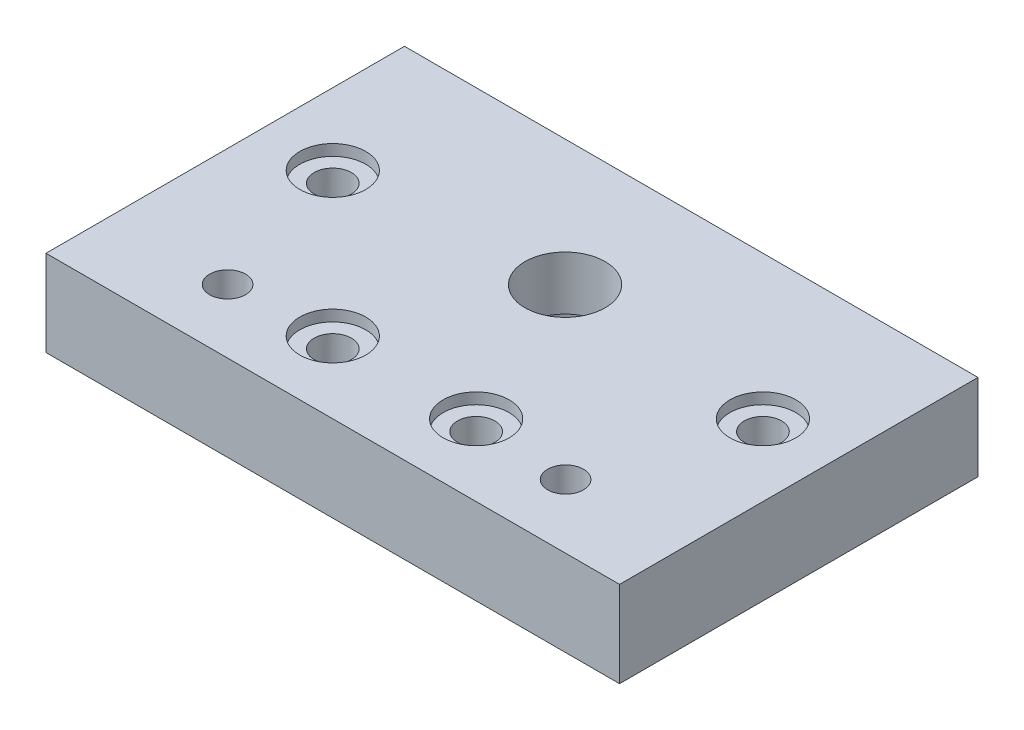
ISO-10303-21;
HEADER;
FILE_DESCRIPTION(('STEP AP214'),'2;1');
FILE_NAME('part.step','',(''),(''),'','','');
FILE_SCHEMA(('AUTOMOTIVE_DESIGN { 1 0 10303 214 1 1 1 1 }'));
ENDSEC;
DATA;
#1=APPLICATION_CONTEXT('core data for automotive mechanical design processes');
#2=APPLICATION_PROTOCOL_DEFINITION('international standard','automotive_design',2000,#1);
#3=PRODUCT_CONTEXT('',#1,'mechanical');
#4=PRODUCT('Part','Part','',(#3));
#5=PRODUCT_RELATED_PRODUCT_CATEGORY('part','',(#4));
#6=PRODUCT_DEFINITION_FORMATION('','',#4);
#7=PRODUCT_DEFINITION_CONTEXT('part definition',#1,'design');
#8=PRODUCT_DEFINITION('design','',#6,#7);
#9=PRODUCT_DEFINITION_SHAPE('','',#8);
#10=(LENGTH_UNIT() NAMED_UNIT(*) SI_UNIT(.MILLI.,.METRE.));
#11=(NAMED_UNIT(*) PLANE_ANGLE_UNIT() SI_UNIT($,.RADIAN.));
#12=(NAMED_UNIT(*) SI_UNIT($,.STERADIAN.) SOLID_ANGLE_UNIT());
#13=UNCERTAINTY_MEASURE_WITH_UNIT(LENGTH_MEASURE(1.E-05),#10,'distance_accuracy_value','');
#14=(GEOMETRIC_REPRESENTATION_CONTEXT(3) GLOBAL_UNCERTAINTY_ASSIGNED_CONTEXT((#13)) GLOBAL_UNIT_ASSIGNED_CONTEXT((#10,
#11,#12)) REPRESENTATION_CONTEXT('',''));
#15=CARTESIAN_POINT('',(0.,0.,0.));
#16=DIRECTION('',(0.,0.,1.));
#17=DIRECTION('',(1.,0.,0.));
#18=AXIS2_PLACEMENT_3D('',#15,#16,#17);
#19=CARTESIAN_POINT('',(0.,12.,0.));
#20=DIRECTION('',(0.,1.,0.));
#21=DIRECTION('',(0.,0.,1.));
#22=AXIS2_PLACEMENT_3D('',#19,#20,#21);
#23=PLANE('',#22);
#24=DIRECTION('',(-1.,0.,0.));
#25=VECTOR('',#24,1.);
#26=CARTESIAN_POINT('',(-40.,12.,-25.));
#27=LINE('',#26,#25);
#28=CARTESIAN_POINT('',(40.,12.,-25.));
#29=VERTEX_POINT('',#28);
#30=CARTESIAN_POINT('',(-40.,12.,-25.));
#31=VERTEX_POINT('',#30);
#32=EDGE_CURVE('E10',#29,#31,#27,.T.);
#33=ORIENTED_EDGE('',*,*,#32,.T.);
#34=DIRECTION('',(0.,0.,1.));
#35=VECTOR('',#34,1.);
#36=CARTESIAN_POINT('',(-40.,12.,25.));
#37=LINE('',#36,#35);
#38=CARTESIAN_POINT('',(-40.,12.,25.));
#39=VERTEX_POINT('',#38);
#40=EDGE_CURVE('E19',#31,#39,#37,.T.);
#41=ORIENTED_EDGE('',*,*,#40,.T.);
#42=DIRECTION('',(1.,0.,0.));
#43=VECTOR('',#42,1.);
#44=CARTESIAN_POINT('',(40.,12.,25.));
#45=LINE('',#44,#43);
#46=CARTESIAN_POINT('',(40.,12.,25.));
#47=VERTEX_POINT('',#46);
#48=EDGE_CURVE('E223',#39,#47,#45,.T.);
#49=ORIENTED_EDGE('',*,*,#48,.T.);
#50=DIRECTION('',(0.,0.,-1.));
#51=VECTOR('',#50,1.);
#52=CARTESIAN_POINT('',(40.,12.,-25.));
#53=LINE('',#52,#51);
#54=EDGE_CURVE('E162',#47,#29,#53,.T.);
#55=ORIENTED_EDGE('',*,*,#54,.T.);
#56=EDGE_LOOP('',(#33,#41,#49,#55));
#57=FACE_BOUND('',#56,.T.);
#58=CARTESIAN_POINT('',(-23.57,12.,16.1));
#59=DIRECTION('',(0.,-1.,0.));
#60=DIRECTION('',(1.,0.,0.));
#61=AXIS2_PLACEMENT_3D('',#58,#59,#60);
#62=CIRCLE('',#61,2.5);
#63=CARTESIAN_POINT('',(-26.07,12.,16.1));
#64=VERTEX_POINT('',#63);
#65=EDGE_CURVE('E139',#64,#64,#62,.T.);
#66=ORIENTED_EDGE('',*,*,#65,.T.);
#67=EDGE_LOOP('',(#66));
#68=FACE_BOUND('',#67,.T.);
#69=CARTESIAN_POINT('',(23.57,12.,16.1));
#70=DIRECTION('',(0.,-1.,0.));
#71=DIRECTION('',(1.,0.,0.));
#72=AXIS2_PLACEMENT_3D('',#69,#70,#71);
#73=CIRCLE('',#72,2.5);
#74=CARTESIAN_POINT('',(21.07,12.,16.1));
#75=VERTEX_POINT('',#74);
#76=EDGE_CURVE('E195',#75,#75,#73,.T.);
#77=ORIENTED_EDGE('',*,*,#76,.T.);
#78=EDGE_LOOP('',(#77));
#79=FACE_BOUND('',#78,.T.);
#80=CARTESIAN_POINT('',(0.,12.,-7.4));
#81=DIRECTION('',(0.,-1.,0.));
#82=DIRECTION('',(1.,0.,0.));
#83=AXIS2_PLACEMENT_3D('',#80,#81,#82);
#84=CIRCLE('',#83,5.59);
#85=CARTESIAN_POINT('',(-5.59,12.,-7.4));
#86=VERTEX_POINT('',#85);
#87=EDGE_CURVE('E206',#86,#86,#84,.T.);
#88=ORIENTED_EDGE('',*,*,#87,.T.);
#89=EDGE_LOOP('',(#88));
#90=FACE_BOUND('',#89,.T.);
#91=CARTESIAN_POINT('',(10.,12.,15.));
#92=DIRECTION('',(0.,-1.,0.));
#93=DIRECTION('',(-1.,0.,0.));
#94=AXIS2_PLACEMENT_3D('',#91,#92,#93);
#95=CIRCLE('',#94,4.6);
#96=CARTESIAN_POINT('',(14.6,12.,15.));
#97=VERTEX_POINT('',#96);
#98=EDGE_CURVE('E182',#97,#97,#95,.T.);
#99=ORIENTED_EDGE('',*,*,#98,.T.);
#100=EDGE_LOOP('',(#99));
#101=FACE_BOUND('',#100,.T.);
#102=CARTESIAN_POINT('',(-30.,12.,-5.));
#103=DIRECTION('',(0.,-1.,0.));
#104=DIRECTION('',(-1.,0.,0.));
#105=AXIS2_PLACEMENT_3D('',#102,#103,#104);
#106=CIRCLE('',#105,4.6);
#107=CARTESIAN_POINT('',(-25.4,12.,-5.));
#108=VERTEX_POINT('',#107);
#109=EDGE_CURVE('E224',#108,#108,#106,.T.);
#110=ORIENTED_EDGE('',*,*,#109,.T.);
#111=EDGE_LOOP('',(#110));
#112=FACE_BOUND('',#111,.T.);
#113=CARTESIAN_POINT('',(-10.,12.,15.));
#114=DIRECTION('',(0.,-1.,0.));
#115=DIRECTION('',(-1.,0.,0.));
#116=AXIS2_PLACEMENT_3D('',#113,#114,#115);
#117=CIRCLE('',#116,4.6);
#118=CARTESIAN_POINT('',(-5.4,12.,15.));
#119=VERTEX_POINT('',#118);
#120=EDGE_CURVE('E177',#119,#119,#117,.T.);
#121=ORIENTED_EDGE('',*,*,#120,.T.);
#122=EDGE_LOOP('',(#121));
#123=FACE_BOUND('',#122,.T.);
#124=CARTESIAN_POINT('',(30.,12.,-5.));
#125=DIRECTION('',(0.,-1.,0.));
#126=DIRECTION('',(-1.,0.,0.));
#127=AXIS2_PLACEMENT_3D('',#124,#125,#126);
#128=CIRCLE('',#127,4.6);
#129=CARTESIAN_POINT('',(34.6,12.,-5.));
#130=VERTEX_POINT('',#129);
#131=EDGE_CURVE('E199',#130,#130,#128,.T.);
#132=ORIENTED_EDGE('',*,*,#131,.T.);
#133=EDGE_LOOP('',(#132));
#134=FACE_BOUND('',#133,.T.);
#135=ADVANCED_FACE('F15',(#57,#68,#79,#90,#101,#112,#123,#134),#23,.T.);
#136=CARTESIAN_POINT('',(0.,0.,0.));
#137=DIRECTION('',(0.,1.,0.));
#138=DIRECTION('',(0.,0.,1.));
#139=AXIS2_PLACEMENT_3D('',#136,#137,#138);
#140=PLANE('',#139);
#141=DIRECTION('',(1.,0.,0.));
#142=VECTOR('',#141,1.);
#143=CARTESIAN_POINT('',(-40.,0.,-25.));
#144=LINE('',#143,#142);
#145=CARTESIAN_POINT('',(-40.,0.,-25.));
#146=VERTEX_POINT('',#145);
#147=CARTESIAN_POINT('',(40.,0.,-25.));
#148=VERTEX_POINT('',#147);
#149=EDGE_CURVE('E26',#146,#148,#144,.T.);
#150=ORIENTED_EDGE('',*,*,#149,.T.);
#151=DIRECTION('',(0.,0.,1.));
#152=VECTOR('',#151,1.);
#153=CARTESIAN_POINT('',(40.,0.,-25.));
#154=LINE('',#153,#152);
#155=CARTESIAN_POINT('',(40.,0.,25.));
#156=VERTEX_POINT('',#155);
#157=EDGE_CURVE('E147',#148,#156,#154,.T.);
#158=ORIENTED_EDGE('',*,*,#157,.T.);
#159=DIRECTION('',(-1.,0.,0.));
#160=VECTOR('',#159,1.);
#161=CARTESIAN_POINT('',(40.,0.,25.));
#162=LINE('',#161,#160);
#163=CARTESIAN_POINT('',(-40.,0.,25.));
#164=VERTEX_POINT('',#163);
#165=EDGE_CURVE('E229',#156,#164,#162,.T.);
#166=ORIENTED_EDGE('',*,*,#165,.T.);
#167=DIRECTION('',(0.,0.,-1.));
#168=VECTOR('',#167,1.);
#169=CARTESIAN_POINT('',(-40.,0.,25.));
#170=LINE('',#169,#168);
#171=EDGE_CURVE('E222',#164,#146,#170,.T.);
#172=ORIENTED_EDGE('',*,*,#171,.T.);
#173=EDGE_LOOP('',(#150,#158,#166,#172));
#174=FACE_BOUND('',#173,.T.);
#175=CARTESIAN_POINT('',(-23.57,0.,16.1));
#176=DIRECTION('',(0.,1.,0.));
#177=DIRECTION('',(1.,0.,0.));
#178=AXIS2_PLACEMENT_3D('',#175,#176,#177);
#179=CIRCLE('',#178,2.5);
#180=CARTESIAN_POINT('',(-26.07,0.,16.1));
#181=VERTEX_POINT('',#180);
#182=EDGE_CURVE('E143',#181,#181,#179,.T.);
#183=ORIENTED_EDGE('',*,*,#182,.T.);
#184=EDGE_LOOP('',(#183));
#185=FACE_BOUND('',#184,.T.);
#186=CARTESIAN_POINT('',(23.57,0.,16.1));
#187=DIRECTION('',(0.,1.,0.));
#188=DIRECTION('',(1.,0.,0.));
#189=AXIS2_PLACEMENT_3D('',#186,#187,#188);
#190=CIRCLE('',#189,2.5);
#191=CARTESIAN_POINT('',(21.07,0.,16.1));
#192=VERTEX_POINT('',#191);
#193=EDGE_CURVE('E153',#192,#192,#190,.T.);
#194=ORIENTED_EDGE('',*,*,#193,.T.);
#195=EDGE_LOOP('',(#194));
#196=FACE_BOUND('',#195,.T.);
#197=CARTESIAN_POINT('',(-30.,0.,-5.));
#198=DIRECTION('',(0.,1.,0.));
#199=DIRECTION('',(1.,0.,0.));
#200=AXIS2_PLACEMENT_3D('',#197,#198,#199);
#201=CIRCLE('',#200,2.6);
#202=CARTESIAN_POINT('',(-32.6,0.,-5.));
#203=VERTEX_POINT('',#202);
#204=EDGE_CURVE('E202',#203,#203,#201,.T.);
#205=ORIENTED_EDGE('',*,*,#204,.T.);
#206=EDGE_LOOP('',(#205));
#207=FACE_BOUND('',#206,.T.);
#208=CARTESIAN_POINT('',(30.,0.,-5.));
#209=DIRECTION('',(0.,1.,0.));
#210=DIRECTION('',(1.,0.,0.));
#211=AXIS2_PLACEMENT_3D('',#208,#209,#210);
#212=CIRCLE('',#211,2.6);
#213=CARTESIAN_POINT('',(27.4,0.,-5.));
#214=VERTEX_POINT('',#213);
#215=EDGE_CURVE('E192',#214,#214,#212,.T.);
#216=ORIENTED_EDGE('',*,*,#215,.T.);
#217=EDGE_LOOP('',(#216));
#218=FACE_BOUND('',#217,.T.);
#219=CARTESIAN_POINT('',(-10.,0.,15.));
#220=DIRECTION('',(0.,1.,0.));
#221=DIRECTION('',(1.,0.,0.));
#222=AXIS2_PLACEMENT_3D('',#219,#220,#221);
#223=CIRCLE('',#222,2.6);
#224=CARTESIAN_POINT('',(-12.6,0.,15.));
#225=VERTEX_POINT('',#224);
#226=EDGE_CURVE('E189',#225,#225,#223,.T.);
#227=ORIENTED_EDGE('',*,*,#226,.T.);
#228=EDGE_LOOP('',(#227));
#229=FACE_BOUND('',#228,.T.);
#230=CARTESIAN_POINT('',(10.,0.,15.));
#231=DIRECTION('',(0.,1.,0.));
#232=DIRECTION('',(1.,0.,0.));
#233=AXIS2_PLACEMENT_3D('',#230,#231,#232);
#234=CIRCLE('',#233,2.6);
#235=CARTESIAN_POINT('',(7.4,0.,15.));
#236=VERTEX_POINT('',#235);
#237=EDGE_CURVE('E193',#236,#236,#234,.T.);
#238=ORIENTED_EDGE('',*,*,#237,.T.);
#239=EDGE_LOOP('',(#238));
#240=FACE_BOUND('',#239,.T.);
#241=CARTESIAN_POINT('',(0.,0.,-7.4));
#242=DIRECTION('',(0.,1.,0.));
#243=DIRECTION('',(-1.,0.,0.));
#244=AXIS2_PLACEMENT_3D('',#241,#242,#243);
#245=CIRCLE('',#244,8.05);
#246=CARTESIAN_POINT('',(8.05,0.,-7.4));
#247=VERTEX_POINT('',#246);
#248=EDGE_CURVE('E113',#247,#247,#245,.T.);
#249=ORIENTED_EDGE('',*,*,#248,.T.);
#250=EDGE_LOOP('',(#249));
#251=FACE_BOUND('',#250,.T.);
#252=ADVANCED_FACE('F144',(#174,#185,#196,#207,#218,#229,#240,#251),#140,.F.);
#253=CARTESIAN_POINT('',(40.,0.,-25.));
#254=DIRECTION('',(0.,0.,-1.));
#255=DIRECTION('',(-1.,0.,0.));
#256=AXIS2_PLACEMENT_3D('',#253,#254,#255);
#257=PLANE('',#256);
#258=ORIENTED_EDGE('',*,*,#149,.F.);
#259=DIRECTION('',(0.,1.,0.));
#260=VECTOR('',#259,1.);
#261=CARTESIAN_POINT('',(-40.,0.,-25.));
#262=LINE('',#261,#260);
#263=EDGE_CURVE('E167',#146,#31,#262,.T.);
#264=ORIENTED_EDGE('',*,*,#263,.T.);
#265=ORIENTED_EDGE('',*,*,#32,.F.);
#266=DIRECTION('',(0.,1.,0.));
#267=VECTOR('',#266,1.);
#268=CARTESIAN_POINT('',(40.,0.,-25.));
#269=LINE('',#268,#267);
#270=EDGE_CURVE('E151',#148,#29,#269,.T.);
#271=ORIENTED_EDGE('',*,*,#270,.F.);
#272=EDGE_LOOP('',(#258,#264,#265,#271));
#273=FACE_BOUND('',#272,.T.);
#274=CARTESIAN_POINT('',(-10.,6.,-25.));
#275=DIRECTION('',(0.,0.,1.));
#276=DIRECTION('',(-1.,0.,0.));
#277=AXIS2_PLACEMENT_3D('',#274,#275,#276);
#278=CIRCLE('',#277,2.067);
#279=CARTESIAN_POINT('',(-12.067,6.,-25.));
#280=VERTEX_POINT('',#279);
#281=EDGE_CURVE('E166',#280,#280,#278,.T.);
#282=ORIENTED_EDGE('',*,*,#281,.T.);
#283=EDGE_LOOP('',(#282));
#284=FACE_BOUND('',#283,.T.);
#285=CARTESIAN_POINT('',(10.,6.,-25.));
#286=DIRECTION('',(0.,0.,1.));
#287=DIRECTION('',(-1.,0.,0.));
#288=AXIS2_PLACEMENT_3D('',#285,#286,#287);
#289=CIRCLE('',#288,2.067);
#290=CARTESIAN_POINT('',(7.933,6.,-25.));
#291=VERTEX_POINT('',#290);
#292=EDGE_CURVE('E157',#291,#291,#289,.T.);
#293=ORIENTED_EDGE('',*,*,#292,.T.);
#294=EDGE_LOOP('',(#293));
#295=FACE_BOUND('',#294,.T.);
#296=ADVANCED_FACE('F258',(#273,#284,#295),#257,.T.);
#297=CARTESIAN_POINT('',(-40.,0.,-25.));
#298=DIRECTION('',(-1.,0.,0.));
#299=DIRECTION('',(0.,0.,1.));
#300=AXIS2_PLACEMENT_3D('',#297,#298,#299);
#301=PLANE('',#300);
#302=ORIENTED_EDGE('',*,*,#171,.F.);
#303=DIRECTION('',(0.,1.,0.));
#304=VECTOR('',#303,1.);
#305=CARTESIAN_POINT('',(-40.,0.,25.));
#306=LINE('',#305,#304);
#307=EDGE_CURVE('E218',#164,#39,#306,.T.);
#308=ORIENTED_EDGE('',*,*,#307,.T.);
#309=ORIENTED_EDGE('',*,*,#40,.F.);
#310=ORIENTED_EDGE('',*,*,#263,.F.);
#311=EDGE_LOOP('',(#302,#308,#309,#310));
#312=FACE_BOUND('',#311,.T.);
#313=ADVANCED_FACE('F248',(#312),#301,.T.);
#314=CARTESIAN_POINT('',(-40.,0.,25.));
#315=DIRECTION('',(0.,0.,1.));
#316=DIRECTION('',(1.,0.,0.));
#317=AXIS2_PLACEMENT_3D('',#314,#315,#316);
#318=PLANE('',#317);
#319=ORIENTED_EDGE('',*,*,#165,.F.);
#320=DIRECTION('',(0.,1.,0.));
#321=VECTOR('',#320,1.);
#322=CARTESIAN_POINT('',(40.,0.,25.));
#323=LINE('',#322,#321);
#324=EDGE_CURVE('E188',#156,#47,#323,.T.);
#325=ORIENTED_EDGE('',*,*,#324,.T.);
#326=ORIENTED_EDGE('',*,*,#48,.F.);
#327=ORIENTED_EDGE('',*,*,#307,.F.);
#328=EDGE_LOOP('',(#319,#325,#326,#327));
#329=FACE_BOUND('',#328,.T.);
#330=ADVANCED_FACE('F250',(#329),#318,.T.);
#331=CARTESIAN_POINT('',(40.,0.,25.));
#332=DIRECTION('',(1.,0.,0.));
#333=DIRECTION('',(0.,0.,-1.));
#334=AXIS2_PLACEMENT_3D('',#331,#332,#333);
#335=PLANE('',#334);
#336=ORIENTED_EDGE('',*,*,#157,.F.);
#337=ORIENTED_EDGE('',*,*,#270,.T.);
#338=ORIENTED_EDGE('',*,*,#54,.F.);
#339=ORIENTED_EDGE('',*,*,#324,.F.);
#340=EDGE_LOOP('',(#336,#337,#338,#339));
#341=FACE_BOUND('',#340,.T.);
#342=ADVANCED_FACE('F255',(#341),#335,.T.);
#343=CARTESIAN_POINT('',(-23.57,0.,16.1));
#344=DIRECTION('',(0.,-1.,0.));
#345=DIRECTION('',(1.,0.,0.));
#346=AXIS2_PLACEMENT_3D('',#343,#344,#345);
#347=CYLINDRICAL_SURFACE('',#346,2.5);
#348=ORIENTED_EDGE('',*,*,#182,.F.);
#349=EDGE_LOOP('',(#348));
#350=FACE_BOUND('',#349,.T.);
#351=ORIENTED_EDGE('',*,*,#65,.F.);
#352=EDGE_LOOP('',(#351));
#353=FACE_BOUND('',#352,.T.);
#354=ADVANCED_FACE('F345',(#350,#353),#347,.F.);
#355=CARTESIAN_POINT('',(23.57,0.,16.1));
#356=DIRECTION('',(0.,-1.,0.));
#357=DIRECTION('',(1.,0.,0.));
#358=AXIS2_PLACEMENT_3D('',#355,#356,#357);
#359=CYLINDRICAL_SURFACE('',#358,2.5);
#360=ORIENTED_EDGE('',*,*,#193,.F.);
#361=EDGE_LOOP('',(#360));
#362=FACE_BOUND('',#361,.T.);
#363=ORIENTED_EDGE('',*,*,#76,.F.);
#364=EDGE_LOOP('',(#363));
#365=FACE_BOUND('',#364,.T.);
#366=ADVANCED_FACE('F308',(#362,#365),#359,.F.);
#367=CARTESIAN_POINT('',(-30.,0.,-5.));
#368=DIRECTION('',(0.,-1.,0.));
#369=DIRECTION('',(1.,0.,0.));
#370=AXIS2_PLACEMENT_3D('',#367,#368,#369);
#371=CYLINDRICAL_SURFACE('',#370,2.6);
#372=ORIENTED_EDGE('',*,*,#204,.F.);
#373=EDGE_LOOP('',(#372));
#374=FACE_BOUND('',#373,.T.);
#375=CARTESIAN_POINT('',(-30.,10.45,-5.));
#376=DIRECTION('',(0.,1.,0.));
#377=DIRECTION('',(1.,0.,0.));
#378=AXIS2_PLACEMENT_3D('',#375,#376,#377);
#379=CIRCLE('',#378,2.6);
#380=CARTESIAN_POINT('',(-27.4,10.45,-5.));
#381=VERTEX_POINT('',#380);
#382=EDGE_CURVE('E226',#381,#381,#379,.T.);
#383=ORIENTED_EDGE('',*,*,#382,.T.);
#384=EDGE_LOOP('',(#383));
#385=FACE_BOUND('',#384,.T.);
#386=ADVANCED_FACE('F266',(#374,#385),#371,.F.);
#387=CARTESIAN_POINT('',(30.,0.,-5.));
#388=DIRECTION('',(0.,-1.,0.));
#389=DIRECTION('',(1.,0.,0.));
#390=AXIS2_PLACEMENT_3D('',#387,#388,#389);
#391=CYLINDRICAL_SURFACE('',#390,2.6);
#392=ORIENTED_EDGE('',*,*,#215,.F.);
#393=EDGE_LOOP('',(#392));
#394=FACE_BOUND('',#393,.T.);
#395=CARTESIAN_POINT('',(30.,10.45,-5.));
#396=DIRECTION('',(0.,1.,0.));
#397=DIRECTION('',(1.,0.,0.));
#398=AXIS2_PLACEMENT_3D('',#395,#396,#397);
#399=CIRCLE('',#398,2.6);
#400=CARTESIAN_POINT('',(27.4,10.45,-5.));
#401=VERTEX_POINT('',#400);
#402=EDGE_CURVE('E205',#401,#401,#399,.T.);
#403=ORIENTED_EDGE('',*,*,#402,.T.);
#404=EDGE_LOOP('',(#403));
#405=FACE_BOUND('',#404,.T.);
#406=ADVANCED_FACE('F17',(#394,#405),#391,.F.);
#407=CARTESIAN_POINT('',(-10.,0.,15.));
#408=DIRECTION('',(0.,-1.,0.));
#409=DIRECTION('',(1.,0.,0.));
#410=AXIS2_PLACEMENT_3D('',#407,#408,#409);
#411=CYLINDRICAL_SURFACE('',#410,2.6);
#412=ORIENTED_EDGE('',*,*,#226,.F.);
#413=EDGE_LOOP('',(#412));
#414=FACE_BOUND('',#413,.T.);
#415=CARTESIAN_POINT('',(-10.,10.45,15.));
#416=DIRECTION('',(0.,1.,0.));
#417=DIRECTION('',(1.,0.,0.));
#418=AXIS2_PLACEMENT_3D('',#415,#416,#417);
#419=CIRCLE('',#418,2.6);
#420=CARTESIAN_POINT('',(-7.4,10.45,15.));
#421=VERTEX_POINT('',#420);
#422=EDGE_CURVE('E174',#421,#421,#419,.T.);
#423=ORIENTED_EDGE('',*,*,#422,.T.);
#424=EDGE_LOOP('',(#423));
#425=FACE_BOUND('',#424,.T.);
#426=ADVANCED_FACE('F320',(#414,#425),#411,.F.);
#427=CARTESIAN_POINT('',(10.,0.,15.));
#428=DIRECTION('',(0.,-1.,0.));
#429=DIRECTION('',(1.,0.,0.));
#430=AXIS2_PLACEMENT_3D('',#427,#428,#429);
#431=CYLINDRICAL_SURFACE('',#430,2.6);
#432=ORIENTED_EDGE('',*,*,#237,.F.);
#433=EDGE_LOOP('',(#432));
#434=FACE_BOUND('',#433,.T.);
#435=CARTESIAN_POINT('',(10.,10.45,15.));
#436=DIRECTION('',(0.,1.,0.));
#437=DIRECTION('',(1.,0.,0.));
#438=AXIS2_PLACEMENT_3D('',#435,#436,#437);
#439=CIRCLE('',#438,2.6);
#440=CARTESIAN_POINT('',(12.6,10.45,15.));
#441=VERTEX_POINT('',#440);
#442=EDGE_CURVE('E184',#441,#441,#439,.T.);
#443=ORIENTED_EDGE('',*,*,#442,.T.);
#444=EDGE_LOOP('',(#443));
#445=FACE_BOUND('',#444,.T.);
#446=ADVANCED_FACE('F317',(#434,#445),#431,.F.);
#447=CARTESIAN_POINT('',(0.,0.,-7.4));
#448=DIRECTION('',(0.,-1.,0.));
#449=DIRECTION('',(1.,0.,0.));
#450=AXIS2_PLACEMENT_3D('',#447,#448,#449);
#451=CYLINDRICAL_SURFACE('',#450,5.59);
#452=ORIENTED_EDGE('',*,*,#87,.F.);
#453=EDGE_LOOP('',(#452));
#454=FACE_BOUND('',#453,.T.);
#455=CARTESIAN_POINT('',(0.,4.5,-7.4));
#456=DIRECTION('',(0.,-1.,0.));
#457=DIRECTION('',(1.,0.,0.));
#458=AXIS2_PLACEMENT_3D('',#455,#456,#457);
#459=CIRCLE('',#458,5.59);
#460=CARTESIAN_POINT('',(-5.59,4.5,-7.4));
#461=VERTEX_POINT('',#460);
#462=EDGE_CURVE('E200',#461,#461,#459,.T.);
#463=ORIENTED_EDGE('',*,*,#462,.T.);
#464=EDGE_LOOP('',(#463));
#465=FACE_BOUND('',#464,.T.);
#466=ADVANCED_FACE('F319',(#454,#465),#451,.F.);
#467=CARTESIAN_POINT('',(10.,10.45,15.));
#468=DIRECTION('',(0.,1.,0.));
#469=DIRECTION('',(0.,0.,1.));
#470=AXIS2_PLACEMENT_3D('',#467,#468,#469);
#471=PLANE('',#470);
#472=CARTESIAN_POINT('',(10.,10.45,15.));
#473=DIRECTION('',(0.,-1.,0.));
#474=DIRECTION('',(-1.,0.,0.));
#475=AXIS2_PLACEMENT_3D('',#472,#473,#474);
#476=CIRCLE('',#475,4.6);
#477=CARTESIAN_POINT('',(14.6,10.45,15.));
#478=VERTEX_POINT('',#477);
#479=EDGE_CURVE('E185',#478,#478,#476,.T.);
#480=ORIENTED_EDGE('',*,*,#479,.F.);
#481=EDGE_LOOP('',(#480));
#482=FACE_BOUND('',#481,.T.);
#483=ORIENTED_EDGE('',*,*,#442,.F.);
#484=EDGE_LOOP('',(#483));
#485=FACE_BOUND('',#484,.T.);
#486=ADVANCED_FACE('F282',(#482,#485),#471,.T.);
#487=CARTESIAN_POINT('',(10.,12.,15.));
#488=DIRECTION('',(0.,1.,0.));
#489=DIRECTION('',(-1.,0.,0.));
#490=AXIS2_PLACEMENT_3D('',#487,#488,#489);
#491=CYLINDRICAL_SURFACE('',#490,4.6);
#492=ORIENTED_EDGE('',*,*,#98,.F.);
#493=EDGE_LOOP('',(#492));
#494=FACE_BOUND('',#493,.T.);
#495=ORIENTED_EDGE('',*,*,#479,.T.);
#496=EDGE_LOOP('',(#495));
#497=FACE_BOUND('',#496,.T.);
#498=ADVANCED_FACE('F271',(#494,#497),#491,.F.);
#499=CARTESIAN_POINT('',(-30.,10.45,-5.));
#500=DIRECTION('',(0.,1.,0.));
#501=DIRECTION('',(0.,0.,1.));
#502=AXIS2_PLACEMENT_3D('',#499,#500,#501);
#503=PLANE('',#502);
#504=CARTESIAN_POINT('',(-30.,10.45,-5.));
#505=DIRECTION('',(0.,-1.,0.));
#506=DIRECTION('',(-1.,0.,0.));
#507=AXIS2_PLACEMENT_3D('',#504,#505,#506);
#508=CIRCLE('',#507,4.6);
#509=CARTESIAN_POINT('',(-25.4,10.45,-5.));
#510=VERTEX_POINT('',#509);
#511=EDGE_CURVE('E176',#510,#510,#508,.T.);
#512=ORIENTED_EDGE('',*,*,#511,.F.);
#513=EDGE_LOOP('',(#512));
#514=FACE_BOUND('',#513,.T.);
#515=ORIENTED_EDGE('',*,*,#382,.F.);
#516=EDGE_LOOP('',(#515));
#517=FACE_BOUND('',#516,.T.);
#518=ADVANCED_FACE('F268',(#514,#517),#503,.T.);
#519=CARTESIAN_POINT('',(-30.,12.,-5.));
#520=DIRECTION('',(0.,1.,0.));
#521=DIRECTION('',(-1.,0.,0.));
#522=AXIS2_PLACEMENT_3D('',#519,#520,#521);
#523=CYLINDRICAL_SURFACE('',#522,4.6);
#524=ORIENTED_EDGE('',*,*,#109,.F.);
#525=EDGE_LOOP('',(#524));
#526=FACE_BOUND('',#525,.T.);
#527=ORIENTED_EDGE('',*,*,#511,.T.);
#528=EDGE_LOOP('',(#527));
#529=FACE_BOUND('',#528,.T.);
#530=ADVANCED_FACE('F270',(#526,#529),#523,.F.);
#531=CARTESIAN_POINT('',(-10.,10.45,15.));
#532=DIRECTION('',(0.,1.,0.));
#533=DIRECTION('',(0.,0.,1.));
#534=AXIS2_PLACEMENT_3D('',#531,#532,#533);
#535=PLANE('',#534);
#536=CARTESIAN_POINT('',(-10.,10.45,15.));
#537=DIRECTION('',(0.,-1.,0.));
#538=DIRECTION('',(-1.,0.,0.));
#539=AXIS2_PLACEMENT_3D('',#536,#537,#538);
#540=CIRCLE('',#539,4.6);
#541=CARTESIAN_POINT('',(-5.4,10.45,15.));
#542=VERTEX_POINT('',#541);
#543=EDGE_CURVE('E181',#542,#542,#540,.T.);
#544=ORIENTED_EDGE('',*,*,#543,.F.);
#545=EDGE_LOOP('',(#544));
#546=FACE_BOUND('',#545,.T.);
#547=ORIENTED_EDGE('',*,*,#422,.F.);
#548=EDGE_LOOP('',(#547));
#549=FACE_BOUND('',#548,.T.);
#550=ADVANCED_FACE('F279',(#546,#549),#535,.T.);
#551=CARTESIAN_POINT('',(-10.,12.,15.));
#552=DIRECTION('',(0.,1.,0.));
#553=DIRECTION('',(-1.,0.,0.));
#554=AXIS2_PLACEMENT_3D('',#551,#552,#553);
#555=CYLINDRICAL_SURFACE('',#554,4.6);
#556=ORIENTED_EDGE('',*,*,#120,.F.);
#557=EDGE_LOOP('',(#556));
#558=FACE_BOUND('',#557,.T.);
#559=ORIENTED_EDGE('',*,*,#543,.T.);
#560=EDGE_LOOP('',(#559));
#561=FACE_BOUND('',#560,.T.);
#562=ADVANCED_FACE('F304',(#558,#561),#555,.F.);
#563=CARTESIAN_POINT('',(30.,10.45,-5.));
#564=DIRECTION('',(0.,1.,0.));
#565=DIRECTION('',(0.,0.,1.));
#566=AXIS2_PLACEMENT_3D('',#563,#564,#565);
#567=PLANE('',#566);
#568=CARTESIAN_POINT('',(30.,10.45,-5.));
#569=DIRECTION('',(0.,-1.,0.));
#570=DIRECTION('',(-1.,0.,0.));
#571=AXIS2_PLACEMENT_3D('',#568,#569,#570);
#572=CIRCLE('',#571,4.6);
#573=CARTESIAN_POINT('',(34.6,10.45,-5.));
#574=VERTEX_POINT('',#573);
#575=EDGE_CURVE('E196',#574,#574,#572,.T.);
#576=ORIENTED_EDGE('',*,*,#575,.F.);
#577=EDGE_LOOP('',(#576));
#578=FACE_BOUND('',#577,.T.);
#579=ORIENTED_EDGE('',*,*,#402,.F.);
#580=EDGE_LOOP('',(#579));
#581=FACE_BOUND('',#580,.T.);
#582=ADVANCED_FACE('F315',(#578,#581),#567,.T.);
#583=CARTESIAN_POINT('',(30.,12.,-5.));
#584=DIRECTION('',(0.,1.,0.));
#585=DIRECTION('',(-1.,0.,0.));
#586=AXIS2_PLACEMENT_3D('',#583,#584,#585);
#587=CYLINDRICAL_SURFACE('',#586,4.6);
#588=ORIENTED_EDGE('',*,*,#131,.F.);
#589=EDGE_LOOP('',(#588));
#590=FACE_BOUND('',#589,.T.);
#591=ORIENTED_EDGE('',*,*,#575,.T.);
#592=EDGE_LOOP('',(#591));
#593=FACE_BOUND('',#592,.T.);
#594=ADVANCED_FACE('F300',(#590,#593),#587,.F.);
#595=CARTESIAN_POINT('',(0.,4.5,-7.4));
#596=DIRECTION('',(0.,1.,0.));
#597=DIRECTION('',(0.,0.,1.));
#598=AXIS2_PLACEMENT_3D('',#595,#596,#597);
#599=PLANE('',#598);
#600=CARTESIAN_POINT('',(0.,4.5,-7.4));
#601=DIRECTION('',(0.,1.,0.));
#602=DIRECTION('',(-1.,0.,0.));
#603=AXIS2_PLACEMENT_3D('',#600,#601,#602);
#604=CIRCLE('',#603,8.05);
#605=CARTESIAN_POINT('',(8.05,4.5,-7.4));
#606=VERTEX_POINT('',#605);
#607=EDGE_CURVE('E120',#606,#606,#604,.T.);
#608=ORIENTED_EDGE('',*,*,#607,.F.);
#609=EDGE_LOOP('',(#608));
#610=FACE_BOUND('',#609,.T.);
#611=ORIENTED_EDGE('',*,*,#462,.F.);
#612=EDGE_LOOP('',(#611));
#613=FACE_BOUND('',#612,.T.);
#614=ADVANCED_FACE('F296',(#610,#613),#599,.F.);
#615=CARTESIAN_POINT('',(0.,0.,-7.4));
#616=DIRECTION('',(0.,-1.,0.));
#617=DIRECTION('',(-1.,0.,0.));
#618=AXIS2_PLACEMENT_3D('',#615,#616,#617);
#619=CYLINDRICAL_SURFACE('',#618,8.05);
#620=ORIENTED_EDGE('',*,*,#248,.F.);
#621=EDGE_LOOP('',(#620));
#622=FACE_BOUND('',#621,.T.);
#623=ORIENTED_EDGE('',*,*,#607,.T.);
#624=EDGE_LOOP('',(#623));
#625=FACE_BOUND('',#624,.T.);
#626=ADVANCED_FACE('F299',(#622,#625),#619,.F.);
#627=CARTESIAN_POINT('',(-10.,6.,-15.));
#628=DIRECTION('',(0.,0.,-1.));
#629=DIRECTION('',(-1.,0.,0.));
#630=AXIS2_PLACEMENT_3D('',#627,#628,#629);
#631=PLANE('',#630);
#632=CARTESIAN_POINT('',(-10.,6.,-15.));
#633=DIRECTION('',(0.,0.,-1.));
#634=DIRECTION('',(-1.,0.,0.));
#635=AXIS2_PLACEMENT_3D('',#632,#633,#634);
#636=CIRCLE('',#635,2.067);
#637=CARTESIAN_POINT('',(-12.067,6.,-15.));
#638=VERTEX_POINT('',#637);
#639=EDGE_CURVE('E171',#638,#638,#636,.T.);
#640=ORIENTED_EDGE('',*,*,#639,.T.);
#641=EDGE_LOOP('',(#640));
#642=FACE_BOUND('',#641,.T.);
#643=ADVANCED_FACE('F312',(#642),#631,.T.);
#644=CARTESIAN_POINT('',(-10.,6.,-20.));
#645=DIRECTION('',(0.,0.,1.));
#646=DIRECTION('',(-1.,0.,0.));
#647=AXIS2_PLACEMENT_3D('',#644,#645,#646);
#648=CYLINDRICAL_SURFACE('',#647,2.067);
#649=ORIENTED_EDGE('',*,*,#639,.F.);
#650=EDGE_LOOP('',(#649));
#651=FACE_BOUND('',#650,.T.);
#652=ORIENTED_EDGE('',*,*,#281,.F.);
#653=EDGE_LOOP('',(#652));
#654=FACE_BOUND('',#653,.T.);
#655=ADVANCED_FACE('F364',(#651,#654),#648,.F.);
#656=CARTESIAN_POINT('',(10.,6.,-15.));
#657=DIRECTION('',(0.,0.,-1.));
#658=DIRECTION('',(-1.,0.,0.));
#659=AXIS2_PLACEMENT_3D('',#656,#657,#658);
#660=PLANE('',#659);
#661=CARTESIAN_POINT('',(10.,6.,-15.));
#662=DIRECTION('',(0.,0.,-1.));
#663=DIRECTION('',(-1.,0.,0.));
#664=AXIS2_PLACEMENT_3D('',#661,#662,#663);
#665=CIRCLE('',#664,2.067);
#666=CARTESIAN_POINT('',(7.933,6.,-15.));
#667=VERTEX_POINT('',#666);
#668=EDGE_CURVE('E163',#667,#667,#665,.T.);
#669=ORIENTED_EDGE('',*,*,#668,.T.);
#670=EDGE_LOOP('',(#669));
#671=FACE_BOUND('',#670,.T.);
#672=ADVANCED_FACE('F360',(#671),#660,.T.);
#673=CARTESIAN_POINT('',(10.,6.,-20.));
#674=DIRECTION('',(0.,0.,1.));
#675=DIRECTION('',(-1.,0.,0.));
#676=AXIS2_PLACEMENT_3D('',#673,#674,#675);
#677=CYLINDRICAL_SURFACE('',#676,2.067);
#678=ORIENTED_EDGE('',*,*,#668,.F.);
#679=EDGE_LOOP('',(#678));
#680=FACE_BOUND('',#679,.T.);
#681=ORIENTED_EDGE('',*,*,#292,.F.);
#682=EDGE_LOOP('',(#681));
#683=FACE_BOUND('',#682,.T.);
#684=ADVANCED_FACE('F357',(#680,#683),#677,.F.);
#685=CLOSED_SHELL('',(#135,#252,#296,#313,#330,#342,#354,#366,#386,#406,#426,#446,#466,#486,
#498,#518,#530,#550,#562,#582,#594,#614,#626,#643,#655,#672,#684));
#686=MANIFOLD_SOLID_BREP('B1',#685);
#687=ADVANCED_BREP_SHAPE_REPRESENTATION('',(#18,#686),#14);
#688=SHAPE_DEFINITION_REPRESENTATION(#9,#687);
ENDSEC;
END-ISO-10303-21;
